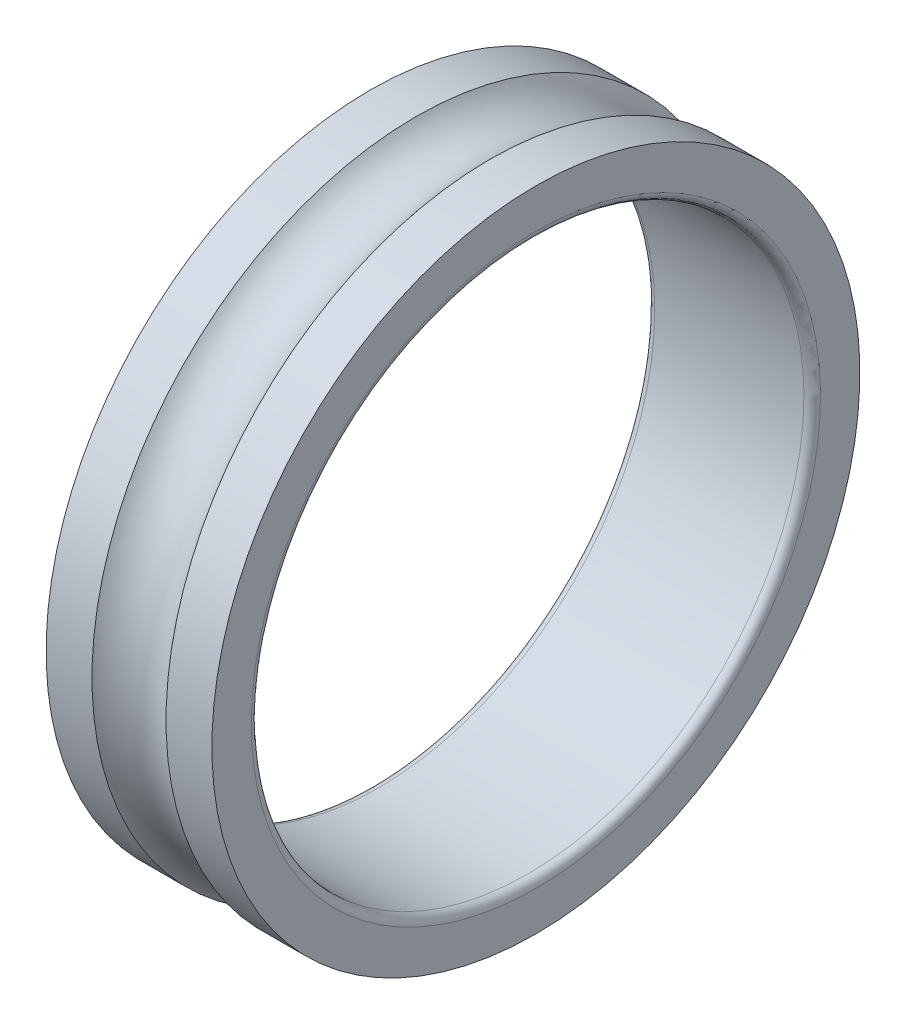
ISO-10303-21;
HEADER;
FILE_DESCRIPTION(('STEP AP214'),'2;1');
FILE_NAME('part.step','',(''),(''),'','','');
FILE_SCHEMA(('AUTOMOTIVE_DESIGN { 1 0 10303 214 1 1 1 1 }'));
ENDSEC;
DATA;
#1=APPLICATION_CONTEXT('core data for automotive mechanical design processes');
#2=APPLICATION_PROTOCOL_DEFINITION('international standard','automotive_design',2000,#1);
#3=PRODUCT_CONTEXT('',#1,'mechanical');
#4=PRODUCT('Part','Part','',(#3));
#5=PRODUCT_RELATED_PRODUCT_CATEGORY('part','',(#4));
#6=PRODUCT_DEFINITION_FORMATION('','',#4);
#7=PRODUCT_DEFINITION_CONTEXT('part definition',#1,'design');
#8=PRODUCT_DEFINITION('design','',#6,#7);
#9=PRODUCT_DEFINITION_SHAPE('','',#8);
#10=(LENGTH_UNIT() NAMED_UNIT(*) SI_UNIT(.MILLI.,.METRE.));
#11=(NAMED_UNIT(*) PLANE_ANGLE_UNIT() SI_UNIT($,.RADIAN.));
#12=(NAMED_UNIT(*) SI_UNIT($,.STERADIAN.) SOLID_ANGLE_UNIT());
#13=UNCERTAINTY_MEASURE_WITH_UNIT(LENGTH_MEASURE(1.E-05),#10,'distance_accuracy_value','');
#14=(GEOMETRIC_REPRESENTATION_CONTEXT(3) GLOBAL_UNCERTAINTY_ASSIGNED_CONTEXT((#13)) GLOBAL_UNIT_ASSIGNED_CONTEXT((#10,
#11,#12)) REPRESENTATION_CONTEXT('',''));
#15=CARTESIAN_POINT('',(0.,0.,0.));
#16=DIRECTION('',(0.,0.,1.));
#17=DIRECTION('',(1.,0.,0.));
#18=AXIS2_PLACEMENT_3D('',#15,#16,#17);
#19=CARTESIAN_POINT('',(10.339589699311,0.,0.));
#20=DIRECTION('',(-1.,0.,0.));
#21=DIRECTION('',(0.,1.,0.));
#22=AXIS2_PLACEMENT_3D('',#19,#20,#21);
#23=CYLINDRICAL_SURFACE('',#22,23.45);
#24=CARTESIAN_POINT('',(8.67917939862192,0.,0.));
#25=DIRECTION('',(1.,0.,0.));
#26=DIRECTION('',(0.,1.,0.));
#27=AXIS2_PLACEMENT_3D('',#24,#25,#26);
#28=CIRCLE('',#27,23.45);
#29=CARTESIAN_POINT('',(8.67917939862192,23.45,0.));
#30=VERTEX_POINT('',#29);
#31=EDGE_CURVE('E11',#30,#30,#28,.T.);
#32=ORIENTED_EDGE('',*,*,#31,.T.);
#33=EDGE_LOOP('',(#32));
#34=FACE_BOUND('',#33,.T.);
#35=CARTESIAN_POINT('',(12.,0.,0.));
#36=DIRECTION('',(1.,0.,0.));
#37=DIRECTION('',(0.,1.,0.));
#38=AXIS2_PLACEMENT_3D('',#35,#36,#37);
#39=CIRCLE('',#38,23.45);
#40=CARTESIAN_POINT('',(12.,23.45,0.));
#41=VERTEX_POINT('',#40);
#42=EDGE_CURVE('E57',#41,#41,#39,.T.);
#43=ORIENTED_EDGE('',*,*,#42,.F.);
#44=EDGE_LOOP('',(#43));
#45=FACE_BOUND('',#44,.T.);
#46=ADVANCED_FACE('F16',(#34,#45),#23,.T.);
#47=CARTESIAN_POINT('',(6.,0.,0.));
#48=DIRECTION('',(1.,0.,0.));
#49=DIRECTION('',(0.,0.,-1.));
#50=AXIS2_PLACEMENT_3D('',#47,#48,#49);
#51=TOROIDAL_SURFACE('',#50,25.5,3.3735);
#52=CARTESIAN_POINT('',(3.3208206013781,0.,0.));
#53=DIRECTION('',(1.,0.,0.));
#54=DIRECTION('',(0.,1.,0.));
#55=AXIS2_PLACEMENT_3D('',#52,#53,#54);
#56=CIRCLE('',#55,23.45);
#57=CARTESIAN_POINT('',(3.3208206013781,23.45,0.));
#58=VERTEX_POINT('',#57);
#59=EDGE_CURVE('E26',#58,#58,#56,.T.);
#60=ORIENTED_EDGE('',*,*,#59,.T.);
#61=EDGE_LOOP('',(#60));
#62=FACE_BOUND('',#61,.T.);
#63=ORIENTED_EDGE('',*,*,#31,.F.);
#64=EDGE_LOOP('',(#63));
#65=FACE_BOUND('',#64,.T.);
#66=ADVANCED_FACE('F18',(#62,#65),#51,.F.);
#67=CARTESIAN_POINT('',(1.66041030068904,0.,0.));
#68=DIRECTION('',(-1.,0.,0.));
#69=DIRECTION('',(0.,1.,0.));
#70=AXIS2_PLACEMENT_3D('',#67,#68,#69);
#71=CYLINDRICAL_SURFACE('',#70,23.45);
#72=CARTESIAN_POINT('',(0.,0.,0.));
#73=DIRECTION('',(1.,0.,0.));
#74=DIRECTION('',(0.,1.,0.));
#75=AXIS2_PLACEMENT_3D('',#72,#73,#74);
#76=CIRCLE('',#75,23.45);
#77=CARTESIAN_POINT('',(0.,23.45,0.));
#78=VERTEX_POINT('',#77);
#79=EDGE_CURVE('E20',#78,#78,#76,.T.);
#80=ORIENTED_EDGE('',*,*,#79,.T.);
#81=EDGE_LOOP('',(#80));
#82=FACE_BOUND('',#81,.T.);
#83=ORIENTED_EDGE('',*,*,#59,.F.);
#84=EDGE_LOOP('',(#83));
#85=FACE_BOUND('',#84,.T.);
#86=ADVANCED_FACE('F74',(#82,#85),#71,.T.);
#87=CARTESIAN_POINT('',(0.,22.025,0.));
#88=DIRECTION('',(-1.,0.,0.));
#89=DIRECTION('',(0.,-1.,0.));
#90=AXIS2_PLACEMENT_3D('',#87,#88,#89);
#91=PLANE('',#90);
#92=CARTESIAN_POINT('',(0.,0.,0.));
#93=DIRECTION('',(1.,0.,0.));
#94=DIRECTION('',(0.,1.,0.));
#95=AXIS2_PLACEMENT_3D('',#92,#93,#94);
#96=CIRCLE('',#95,20.6);
#97=CARTESIAN_POINT('',(0.,20.6,0.));
#98=VERTEX_POINT('',#97);
#99=EDGE_CURVE('E59',#98,#98,#96,.T.);
#100=ORIENTED_EDGE('',*,*,#99,.T.);
#101=EDGE_LOOP('',(#100));
#102=FACE_BOUND('',#101,.T.);
#103=ORIENTED_EDGE('',*,*,#79,.F.);
#104=EDGE_LOOP('',(#103));
#105=FACE_BOUND('',#104,.T.);
#106=ADVANCED_FACE('F76',(#102,#105),#91,.T.);
#107=CARTESIAN_POINT('',(0.6,0.,0.));
#108=DIRECTION('',(1.,0.,0.));
#109=DIRECTION('',(0.,0.,-1.));
#110=AXIS2_PLACEMENT_3D('',#107,#108,#109);
#111=TOROIDAL_SURFACE('',#110,20.6,0.6);
#112=CARTESIAN_POINT('',(0.6,0.,0.));
#113=DIRECTION('',(1.,0.,0.));
#114=DIRECTION('',(0.,1.,0.));
#115=AXIS2_PLACEMENT_3D('',#112,#113,#114);
#116=CIRCLE('',#115,20.);
#117=CARTESIAN_POINT('',(0.6,20.,0.));
#118=VERTEX_POINT('',#117);
#119=EDGE_CURVE('E49',#118,#118,#116,.T.);
#120=ORIENTED_EDGE('',*,*,#119,.T.);
#121=EDGE_LOOP('',(#120));
#122=FACE_BOUND('',#121,.T.);
#123=ORIENTED_EDGE('',*,*,#99,.F.);
#124=EDGE_LOOP('',(#123));
#125=FACE_BOUND('',#124,.T.);
#126=ADVANCED_FACE('F83',(#122,#125),#111,.T.);
#127=CARTESIAN_POINT('',(6.,0.,0.));
#128=DIRECTION('',(-1.,0.,0.));
#129=DIRECTION('',(0.,1.,0.));
#130=AXIS2_PLACEMENT_3D('',#127,#128,#129);
#131=CYLINDRICAL_SURFACE('',#130,20.);
#132=CARTESIAN_POINT('',(11.4,0.,0.));
#133=DIRECTION('',(1.,0.,0.));
#134=DIRECTION('',(0.,1.,0.));
#135=AXIS2_PLACEMENT_3D('',#132,#133,#134);
#136=CIRCLE('',#135,20.);
#137=CARTESIAN_POINT('',(11.4,20.,0.));
#138=VERTEX_POINT('',#137);
#139=EDGE_CURVE('E53',#138,#138,#136,.T.);
#140=ORIENTED_EDGE('',*,*,#139,.T.);
#141=EDGE_LOOP('',(#140));
#142=FACE_BOUND('',#141,.T.);
#143=ORIENTED_EDGE('',*,*,#119,.F.);
#144=EDGE_LOOP('',(#143));
#145=FACE_BOUND('',#144,.T.);
#146=ADVANCED_FACE('F54',(#142,#145),#131,.F.);
#147=CARTESIAN_POINT('',(11.4,0.,0.));
#148=DIRECTION('',(1.,0.,0.));
#149=DIRECTION('',(0.,0.,-1.));
#150=AXIS2_PLACEMENT_3D('',#147,#148,#149);
#151=TOROIDAL_SURFACE('',#150,20.6,0.6);
#152=CARTESIAN_POINT('',(12.,0.,0.));
#153=DIRECTION('',(1.,0.,0.));
#154=DIRECTION('',(0.,1.,0.));
#155=AXIS2_PLACEMENT_3D('',#152,#153,#154);
#156=CIRCLE('',#155,20.6);
#157=CARTESIAN_POINT('',(12.,20.6,0.));
#158=VERTEX_POINT('',#157);
#159=EDGE_CURVE('E61',#158,#158,#156,.T.);
#160=ORIENTED_EDGE('',*,*,#159,.T.);
#161=EDGE_LOOP('',(#160));
#162=FACE_BOUND('',#161,.T.);
#163=ORIENTED_EDGE('',*,*,#139,.F.);
#164=EDGE_LOOP('',(#163));
#165=FACE_BOUND('',#164,.T.);
#166=ADVANCED_FACE('F94',(#162,#165),#151,.T.);
#167=CARTESIAN_POINT('',(12.,22.025,0.));
#168=DIRECTION('',(1.,0.,0.));
#169=DIRECTION('',(0.,1.,0.));
#170=AXIS2_PLACEMENT_3D('',#167,#168,#169);
#171=PLANE('',#170);
#172=ORIENTED_EDGE('',*,*,#42,.T.);
#173=EDGE_LOOP('',(#172));
#174=FACE_BOUND('',#173,.T.);
#175=ORIENTED_EDGE('',*,*,#159,.F.);
#176=EDGE_LOOP('',(#175));
#177=FACE_BOUND('',#176,.T.);
#178=ADVANCED_FACE('F92',(#174,#177),#171,.T.);
#179=CLOSED_SHELL('',(#46,#66,#86,#106,#126,#146,#166,#178));
#180=MANIFOLD_SOLID_BREP('B1',#179);
#181=ADVANCED_BREP_SHAPE_REPRESENTATION('',(#18,#180),#14);
#182=SHAPE_DEFINITION_REPRESENTATION(#9,#181);
ENDSEC;
END-ISO-10303-21;
